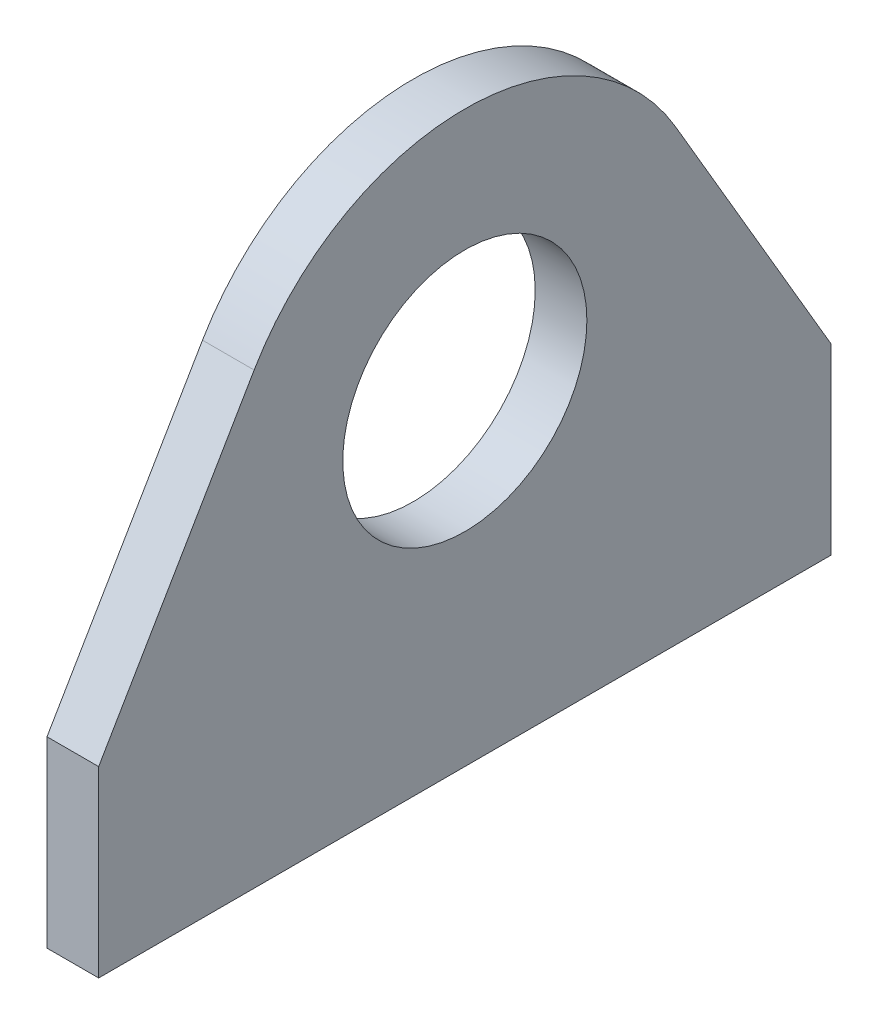
ISO-10303-21;
HEADER;
FILE_DESCRIPTION(('STEP AP214'),'2;1');
FILE_NAME('part.step','',(''),(''),'','','');
FILE_SCHEMA(('AUTOMOTIVE_DESIGN { 1 0 10303 214 1 1 1 1 }'));
ENDSEC;
DATA;
#1=APPLICATION_CONTEXT('core data for automotive mechanical design processes');
#2=APPLICATION_PROTOCOL_DEFINITION('international standard','automotive_design',2000,#1);
#3=PRODUCT_CONTEXT('',#1,'mechanical');
#4=PRODUCT('Part','Part','',(#3));
#5=PRODUCT_RELATED_PRODUCT_CATEGORY('part','',(#4));
#6=PRODUCT_DEFINITION_FORMATION('','',#4);
#7=PRODUCT_DEFINITION_CONTEXT('part definition',#1,'design');
#8=PRODUCT_DEFINITION('design','',#6,#7);
#9=PRODUCT_DEFINITION_SHAPE('','',#8);
#10=(LENGTH_UNIT() NAMED_UNIT(*) SI_UNIT(.MILLI.,.METRE.));
#11=(NAMED_UNIT(*) PLANE_ANGLE_UNIT() SI_UNIT($,.RADIAN.));
#12=(NAMED_UNIT(*) SI_UNIT($,.STERADIAN.) SOLID_ANGLE_UNIT());
#13=UNCERTAINTY_MEASURE_WITH_UNIT(LENGTH_MEASURE(1.E-05),#10,'distance_accuracy_value','');
#14=(GEOMETRIC_REPRESENTATION_CONTEXT(3) GLOBAL_UNCERTAINTY_ASSIGNED_CONTEXT((#13)) GLOBAL_UNIT_ASSIGNED_CONTEXT((#10,
#11,#12)) REPRESENTATION_CONTEXT('',''));
#15=CARTESIAN_POINT('',(0.,0.,0.));
#16=DIRECTION('',(0.,0.,1.));
#17=DIRECTION('',(1.,0.,0.));
#18=AXIS2_PLACEMENT_3D('',#15,#16,#17);
#19=CARTESIAN_POINT('',(6.35,80.,0.));
#20=DIRECTION('',(1.,0.,0.));
#21=DIRECTION('',(0.,0.,-1.));
#22=AXIS2_PLACEMENT_3D('',#19,#20,#21);
#23=PLANE('',#22);
#24=DIRECTION('',(0.,0.,-1.));
#25=VECTOR('',#24,1.);
#26=CARTESIAN_POINT('',(6.35,0.,90.));
#27=LINE('',#26,#25);
#28=CARTESIAN_POINT('',(6.35,0.,90.));
#29=VERTEX_POINT('',#28);
#30=CARTESIAN_POINT('',(6.35,0.,-90.));
#31=VERTEX_POINT('',#30);
#32=EDGE_CURVE('E135',#29,#31,#27,.T.);
#33=ORIENTED_EDGE('',*,*,#32,.T.);
#34=DIRECTION('',(0.,1.,0.));
#35=VECTOR('',#34,1.);
#36=CARTESIAN_POINT('',(6.35,0.,-90.));
#37=LINE('',#36,#35);
#38=CARTESIAN_POINT('',(6.35,45.,-90.));
#39=VERTEX_POINT('',#38);
#40=EDGE_CURVE('E93',#31,#39,#37,.T.);
#41=ORIENTED_EDGE('',*,*,#40,.T.);
#42=DIRECTION('',(0.,0.86308102319826,0.505065488224097));
#43=VECTOR('',#42,1.);
#44=CARTESIAN_POINT('',(6.35,45.,-90.));
#45=LINE('',#44,#43);
#46=CARTESIAN_POINT('',(6.35,110.303929293446,-51.7848613918956));
#47=VERTEX_POINT('',#46);
#48=EDGE_CURVE('E106',#39,#47,#45,.T.);
#49=ORIENTED_EDGE('',*,*,#48,.T.);
#50=CARTESIAN_POINT('',(6.35,80.,0.));
#51=DIRECTION('',(1.,0.,0.));
#52=DIRECTION('',(0.,0.,-1.));
#53=AXIS2_PLACEMENT_3D('',#50,#51,#52);
#54=CIRCLE('',#53,60.);
#55=CARTESIAN_POINT('',(6.35,110.303929293446,51.7848613918956));
#56=VERTEX_POINT('',#55);
#57=EDGE_CURVE('E100',#47,#56,#54,.T.);
#58=ORIENTED_EDGE('',*,*,#57,.T.);
#59=DIRECTION('',(0.,-0.86308102319826,0.505065488224097));
#60=VECTOR('',#59,1.);
#61=CARTESIAN_POINT('',(6.35,45.,90.));
#62=LINE('',#61,#60);
#63=CARTESIAN_POINT('',(6.35,45.,90.));
#64=VERTEX_POINT('',#63);
#65=EDGE_CURVE('E104',#56,#64,#62,.T.);
#66=ORIENTED_EDGE('',*,*,#65,.T.);
#67=DIRECTION('',(0.,-1.,0.));
#68=VECTOR('',#67,1.);
#69=CARTESIAN_POINT('',(6.35,0.,90.));
#70=LINE('',#69,#68);
#71=EDGE_CURVE('E56',#64,#29,#70,.T.);
#72=ORIENTED_EDGE('',*,*,#71,.T.);
#73=EDGE_LOOP('',(#33,#41,#49,#58,#66,#72));
#74=FACE_BOUND('',#73,.T.);
#75=CARTESIAN_POINT('',(6.35,80.,0.));
#76=DIRECTION('',(1.,0.,0.));
#77=DIRECTION('',(0.,0.,-1.));
#78=AXIS2_PLACEMENT_3D('',#75,#76,#77);
#79=CIRCLE('',#78,30.);
#80=CARTESIAN_POINT('',(6.35,80.,-30.));
#81=VERTEX_POINT('',#80);
#82=EDGE_CURVE('E128',#81,#81,#79,.T.);
#83=ORIENTED_EDGE('',*,*,#82,.F.);
#84=EDGE_LOOP('',(#83));
#85=FACE_BOUND('',#84,.T.);
#86=ADVANCED_FACE('F39',(#74,#85),#23,.T.);
#87=CARTESIAN_POINT('',(-6.35,80.,0.));
#88=DIRECTION('',(1.,0.,0.));
#89=DIRECTION('',(0.,0.,-1.));
#90=AXIS2_PLACEMENT_3D('',#87,#88,#89);
#91=PLANE('',#90);
#92=DIRECTION('',(0.,0.,-1.));
#93=VECTOR('',#92,1.);
#94=CARTESIAN_POINT('',(-6.35,0.,90.));
#95=LINE('',#94,#93);
#96=CARTESIAN_POINT('',(-6.35,0.,90.));
#97=VERTEX_POINT('',#96);
#98=CARTESIAN_POINT('',(-6.35,0.,-90.));
#99=VERTEX_POINT('',#98);
#100=EDGE_CURVE('E124',#97,#99,#95,.T.);
#101=ORIENTED_EDGE('',*,*,#100,.F.);
#102=DIRECTION('',(0.,-1.,0.));
#103=VECTOR('',#102,1.);
#104=CARTESIAN_POINT('',(-6.35,0.,90.));
#105=LINE('',#104,#103);
#106=CARTESIAN_POINT('',(-6.35,45.,90.));
#107=VERTEX_POINT('',#106);
#108=EDGE_CURVE('E85',#107,#97,#105,.T.);
#109=ORIENTED_EDGE('',*,*,#108,.F.);
#110=DIRECTION('',(0.,-0.86308102319826,0.505065488224097));
#111=VECTOR('',#110,1.);
#112=CARTESIAN_POINT('',(-6.35,45.,90.));
#113=LINE('',#112,#111);
#114=CARTESIAN_POINT('',(-6.35,110.303929293446,51.7848613918956));
#115=VERTEX_POINT('',#114);
#116=EDGE_CURVE('E79',#115,#107,#113,.T.);
#117=ORIENTED_EDGE('',*,*,#116,.F.);
#118=CARTESIAN_POINT('',(-6.35,80.,0.));
#119=DIRECTION('',(1.,0.,0.));
#120=DIRECTION('',(0.,0.,-1.));
#121=AXIS2_PLACEMENT_3D('',#118,#119,#120);
#122=CIRCLE('',#121,60.);
#123=CARTESIAN_POINT('',(-6.35,110.303929293446,-51.7848613918956));
#124=VERTEX_POINT('',#123);
#125=EDGE_CURVE('E114',#124,#115,#122,.T.);
#126=ORIENTED_EDGE('',*,*,#125,.F.);
#127=DIRECTION('',(0.,0.86308102319826,0.505065488224097));
#128=VECTOR('',#127,1.);
#129=CARTESIAN_POINT('',(-6.35,45.,-90.));
#130=LINE('',#129,#128);
#131=CARTESIAN_POINT('',(-6.35,45.,-90.));
#132=VERTEX_POINT('',#131);
#133=EDGE_CURVE('E130',#132,#124,#130,.T.);
#134=ORIENTED_EDGE('',*,*,#133,.F.);
#135=DIRECTION('',(0.,1.,0.));
#136=VECTOR('',#135,1.);
#137=CARTESIAN_POINT('',(-6.35,0.,-90.));
#138=LINE('',#137,#136);
#139=EDGE_CURVE('E127',#99,#132,#138,.T.);
#140=ORIENTED_EDGE('',*,*,#139,.F.);
#141=EDGE_LOOP('',(#101,#109,#117,#126,#134,#140));
#142=FACE_BOUND('',#141,.T.);
#143=CARTESIAN_POINT('',(-6.35,80.,0.));
#144=DIRECTION('',(1.,0.,0.));
#145=DIRECTION('',(0.,0.,-1.));
#146=AXIS2_PLACEMENT_3D('',#143,#144,#145);
#147=CIRCLE('',#146,30.);
#148=CARTESIAN_POINT('',(-6.35,80.,-30.));
#149=VERTEX_POINT('',#148);
#150=EDGE_CURVE('E242',#149,#149,#147,.T.);
#151=ORIENTED_EDGE('',*,*,#150,.T.);
#152=EDGE_LOOP('',(#151));
#153=FACE_BOUND('',#152,.T.);
#154=ADVANCED_FACE('F144',(#142,#153),#91,.F.);
#155=CARTESIAN_POINT('',(6.35,0.,90.));
#156=DIRECTION('',(0.,1.,0.));
#157=DIRECTION('',(0.,0.,1.));
#158=AXIS2_PLACEMENT_3D('',#155,#156,#157);
#159=PLANE('',#158);
#160=ORIENTED_EDGE('',*,*,#100,.T.);
#161=DIRECTION('',(-1.,0.,0.));
#162=VECTOR('',#161,1.);
#163=CARTESIAN_POINT('',(6.35,0.,-90.));
#164=LINE('',#163,#162);
#165=EDGE_CURVE('E11',#31,#99,#164,.T.);
#166=ORIENTED_EDGE('',*,*,#165,.F.);
#167=ORIENTED_EDGE('',*,*,#32,.F.);
#168=DIRECTION('',(-1.,0.,0.));
#169=VECTOR('',#168,1.);
#170=CARTESIAN_POINT('',(6.35,0.,90.));
#171=LINE('',#170,#169);
#172=EDGE_CURVE('E120',#29,#97,#171,.T.);
#173=ORIENTED_EDGE('',*,*,#172,.T.);
#174=EDGE_LOOP('',(#160,#166,#167,#173));
#175=FACE_BOUND('',#174,.T.);
#176=ADVANCED_FACE('F41',(#175),#159,.F.);
#177=CARTESIAN_POINT('',(6.35,0.,-90.));
#178=DIRECTION('',(0.,0.,1.));
#179=DIRECTION('',(1.,0.,0.));
#180=AXIS2_PLACEMENT_3D('',#177,#178,#179);
#181=PLANE('',#180);
#182=ORIENTED_EDGE('',*,*,#139,.T.);
#183=DIRECTION('',(-1.,0.,0.));
#184=VECTOR('',#183,1.);
#185=CARTESIAN_POINT('',(6.35,45.,-90.));
#186=LINE('',#185,#184);
#187=EDGE_CURVE('E48',#39,#132,#186,.T.);
#188=ORIENTED_EDGE('',*,*,#187,.F.);
#189=ORIENTED_EDGE('',*,*,#40,.F.);
#190=ORIENTED_EDGE('',*,*,#165,.T.);
#191=EDGE_LOOP('',(#182,#188,#189,#190));
#192=FACE_BOUND('',#191,.T.);
#193=ADVANCED_FACE('F169',(#192),#181,.F.);
#194=CARTESIAN_POINT('',(6.35,45.,-90.));
#195=DIRECTION('',(0.,-0.505065488224097,0.86308102319826));
#196=DIRECTION('',(0.,-0.86308102319826,-0.505065488224097));
#197=AXIS2_PLACEMENT_3D('',#194,#195,#196);
#198=PLANE('',#197);
#199=ORIENTED_EDGE('',*,*,#133,.T.);
#200=DIRECTION('',(-1.,0.,0.));
#201=VECTOR('',#200,1.);
#202=CARTESIAN_POINT('',(6.35,110.303929293446,-51.7848613918956));
#203=LINE('',#202,#201);
#204=EDGE_CURVE('E115',#47,#124,#203,.T.);
#205=ORIENTED_EDGE('',*,*,#204,.F.);
#206=ORIENTED_EDGE('',*,*,#48,.F.);
#207=ORIENTED_EDGE('',*,*,#187,.T.);
#208=EDGE_LOOP('',(#199,#205,#206,#207));
#209=FACE_BOUND('',#208,.T.);
#210=ADVANCED_FACE('F141',(#209),#198,.F.);
#211=CARTESIAN_POINT('',(6.35,80.,0.));
#212=DIRECTION('',(-1.,0.,0.));
#213=DIRECTION('',(0.,0.,1.));
#214=AXIS2_PLACEMENT_3D('',#211,#212,#213);
#215=CYLINDRICAL_SURFACE('',#214,60.);
#216=ORIENTED_EDGE('',*,*,#125,.T.);
#217=DIRECTION('',(-1.,0.,0.));
#218=VECTOR('',#217,1.);
#219=CARTESIAN_POINT('',(6.35,110.303929293446,51.7848613918956));
#220=LINE('',#219,#218);
#221=EDGE_CURVE('E111',#56,#115,#220,.T.);
#222=ORIENTED_EDGE('',*,*,#221,.F.);
#223=ORIENTED_EDGE('',*,*,#57,.F.);
#224=ORIENTED_EDGE('',*,*,#204,.T.);
#225=EDGE_LOOP('',(#216,#222,#223,#224));
#226=FACE_BOUND('',#225,.T.);
#227=ADVANCED_FACE('F112',(#226),#215,.T.);
#228=CARTESIAN_POINT('',(6.35,45.,90.));
#229=DIRECTION('',(0.,-0.505065488224097,-0.86308102319826));
#230=DIRECTION('',(0.,0.86308102319826,-0.505065488224097));
#231=AXIS2_PLACEMENT_3D('',#228,#229,#230);
#232=PLANE('',#231);
#233=ORIENTED_EDGE('',*,*,#116,.T.);
#234=DIRECTION('',(-1.,0.,0.));
#235=VECTOR('',#234,1.);
#236=CARTESIAN_POINT('',(6.35,45.,90.));
#237=LINE('',#236,#235);
#238=EDGE_CURVE('E116',#64,#107,#237,.T.);
#239=ORIENTED_EDGE('',*,*,#238,.F.);
#240=ORIENTED_EDGE('',*,*,#65,.F.);
#241=ORIENTED_EDGE('',*,*,#221,.T.);
#242=EDGE_LOOP('',(#233,#239,#240,#241));
#243=FACE_BOUND('',#242,.T.);
#244=ADVANCED_FACE('F118',(#243),#232,.F.);
#245=CARTESIAN_POINT('',(6.35,0.,90.));
#246=DIRECTION('',(0.,0.,-1.));
#247=DIRECTION('',(-1.,0.,0.));
#248=AXIS2_PLACEMENT_3D('',#245,#246,#247);
#249=PLANE('',#248);
#250=ORIENTED_EDGE('',*,*,#108,.T.);
#251=ORIENTED_EDGE('',*,*,#172,.F.);
#252=ORIENTED_EDGE('',*,*,#71,.F.);
#253=ORIENTED_EDGE('',*,*,#238,.T.);
#254=EDGE_LOOP('',(#250,#251,#252,#253));
#255=FACE_BOUND('',#254,.T.);
#256=ADVANCED_FACE('F149',(#255),#249,.F.);
#257=CARTESIAN_POINT('',(6.35,80.,0.));
#258=DIRECTION('',(-1.,0.,0.));
#259=DIRECTION('',(0.,0.,1.));
#260=AXIS2_PLACEMENT_3D('',#257,#258,#259);
#261=CYLINDRICAL_SURFACE('',#260,30.);
#262=ORIENTED_EDGE('',*,*,#82,.T.);
#263=EDGE_LOOP('',(#262));
#264=FACE_BOUND('',#263,.T.);
#265=ORIENTED_EDGE('',*,*,#150,.F.);
#266=EDGE_LOOP('',(#265));
#267=FACE_BOUND('',#266,.T.);
#268=ADVANCED_FACE('F151',(#264,#267),#261,.F.);
#269=CLOSED_SHELL('',(#86,#154,#176,#193,#210,#227,#244,#256,#268));
#270=MANIFOLD_SOLID_BREP('B2',#269);
#271=ADVANCED_BREP_SHAPE_REPRESENTATION('',(#18,#270),#14);
#272=SHAPE_DEFINITION_REPRESENTATION(#9,#271);
ENDSEC;
END-ISO-10303-21;
